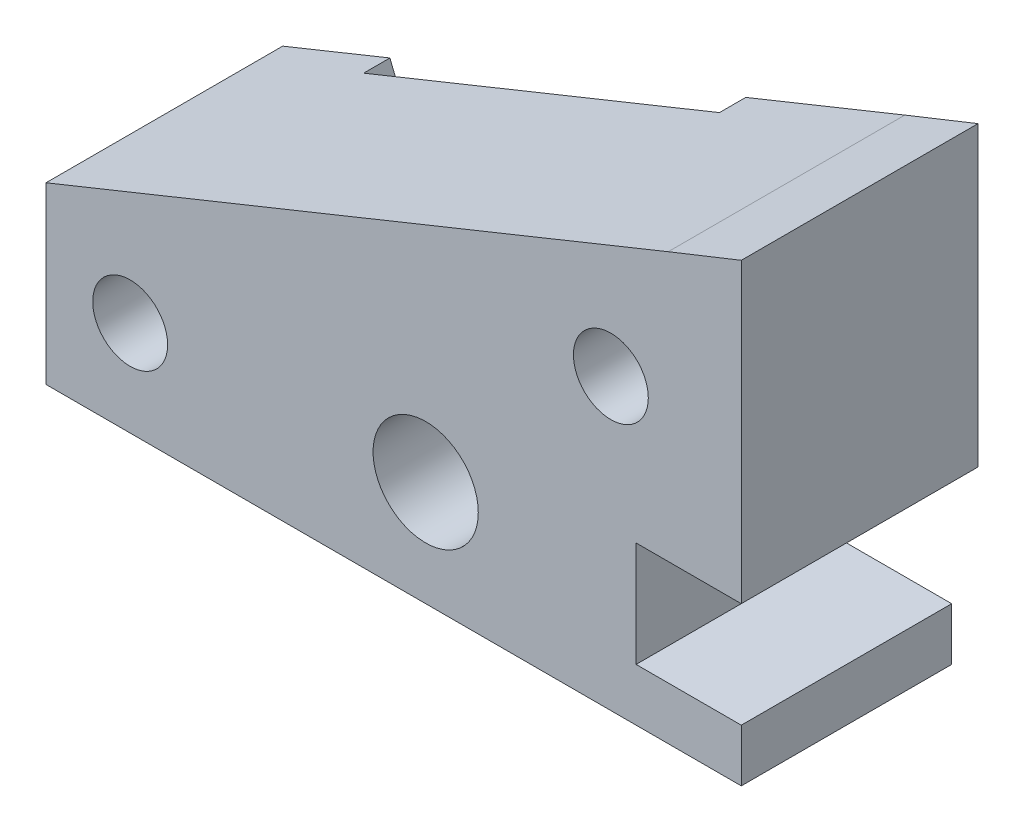
ISO-10303-21;
HEADER;
FILE_DESCRIPTION(('STEP AP214'),'2;1');
FILE_NAME('part.step','',(''),(''),'','','');
FILE_SCHEMA(('AUTOMOTIVE_DESIGN { 1 0 10303 214 1 1 1 1 }'));
ENDSEC;
DATA;
#1=APPLICATION_CONTEXT('core data for automotive mechanical design processes');
#2=APPLICATION_PROTOCOL_DEFINITION('international standard','automotive_design',2000,#1);
#3=PRODUCT_CONTEXT('',#1,'mechanical');
#4=PRODUCT('Part','Part','',(#3));
#5=PRODUCT_RELATED_PRODUCT_CATEGORY('part','',(#4));
#6=PRODUCT_DEFINITION_FORMATION('','',#4);
#7=PRODUCT_DEFINITION_CONTEXT('part definition',#1,'design');
#8=PRODUCT_DEFINITION('design','',#6,#7);
#9=PRODUCT_DEFINITION_SHAPE('','',#8);
#10=(LENGTH_UNIT() NAMED_UNIT(*) SI_UNIT(.MILLI.,.METRE.));
#11=(NAMED_UNIT(*) PLANE_ANGLE_UNIT() SI_UNIT($,.RADIAN.));
#12=(NAMED_UNIT(*) SI_UNIT($,.STERADIAN.) SOLID_ANGLE_UNIT());
#13=UNCERTAINTY_MEASURE_WITH_UNIT(LENGTH_MEASURE(1.E-05),#10,'distance_accuracy_value','');
#14=(GEOMETRIC_REPRESENTATION_CONTEXT(3) GLOBAL_UNCERTAINTY_ASSIGNED_CONTEXT((#13)) GLOBAL_UNIT_ASSIGNED_CONTEXT((#10,
#11,#12)) REPRESENTATION_CONTEXT('',''));
#15=CARTESIAN_POINT('',(0.,0.,0.));
#16=DIRECTION('',(0.,0.,1.));
#17=DIRECTION('',(1.,0.,0.));
#18=AXIS2_PLACEMENT_3D('',#15,#16,#17);
#19=CARTESIAN_POINT('',(-11.4586639342253,-3.17499999999992,0.));
#20=DIRECTION('',(0.,0.,-1.));
#21=DIRECTION('',(-1.,0.,0.));
#22=AXIS2_PLACEMENT_3D('',#19,#20,#21);
#23=PLANE('',#22);
#24=CARTESIAN_POINT('',(-8.91866393422528,-0.301005902888601,0.));
#25=DIRECTION('',(0.,0.,1.));
#26=DIRECTION('',(1.,0.,0.));
#27=AXIS2_PLACEMENT_3D('',#24,#25,#26);
#28=CIRCLE('',#27,1.1303);
#29=CARTESIAN_POINT('',(-7.78836393422528,-0.301005902888601,0.));
#30=VERTEX_POINT('',#29);
#31=EDGE_CURVE('E271',#30,#30,#28,.T.);
#32=ORIENTED_EDGE('',*,*,#31,.T.);
#33=EDGE_LOOP('',(#32));
#34=FACE_BOUND('',#33,.T.);
#35=DIRECTION('',(-0.927183854566792,-0.3746065934159,0.));
#36=VECTOR('',#35,1.);
#37=CARTESIAN_POINT('',(-11.4586639342253,2.09711529149145,0.));
#38=LINE('',#37,#36);
#39=CARTESIAN_POINT('',(-8.22400227584104,3.40400343318207,0.));
#40=VERTEX_POINT('',#39);
#41=CARTESIAN_POINT('',(-11.4586639342253,2.09711529149145,0.));
#42=VERTEX_POINT('',#41);
#43=EDGE_CURVE('E164',#40,#42,#38,.T.);
#44=ORIENTED_EDGE('',*,*,#43,.F.);
#45=DIRECTION('',(0.374606593415901,-0.927183854566792,0.));
#46=VECTOR('',#45,1.);
#47=CARTESIAN_POINT('',(-8.22400227584104,3.40400343318207,0.));
#48=LINE('',#47,#46);
#49=CARTESIAN_POINT('',(-5.56591234897607,-3.17499999999993,0.));
#50=VERTEX_POINT('',#49);
#51=EDGE_CURVE('E229',#40,#50,#48,.T.);
#52=ORIENTED_EDGE('',*,*,#51,.T.);
#53=DIRECTION('',(1.,0.,0.));
#54=VECTOR('',#53,1.);
#55=CARTESIAN_POINT('',(9.52499999999998,-3.17500000000007,0.));
#56=LINE('',#55,#54);
#57=CARTESIAN_POINT('',(-11.4586639342253,-3.17499999999992,0.));
#58=VERTEX_POINT('',#57);
#59=EDGE_CURVE('E150',#58,#50,#56,.T.);
#60=ORIENTED_EDGE('',*,*,#59,.F.);
#61=DIRECTION('',(0.,-1.,0.));
#62=VECTOR('',#61,1.);
#63=CARTESIAN_POINT('',(-11.4586639342253,-3.17499999999992,0.));
#64=LINE('',#63,#62);
#65=EDGE_CURVE('E89',#42,#58,#64,.T.);
#66=ORIENTED_EDGE('',*,*,#65,.F.);
#67=EDGE_LOOP('',(#44,#52,#60,#66));
#68=FACE_BOUND('',#67,.T.);
#69=ADVANCED_FACE('F40',(#34,#68),#23,.T.);
#70=CARTESIAN_POINT('',(5.58842552786858,5.56023870033394,0.));
#71=DIRECTION('',(0.,0.,1.));
#72=DIRECTION('',(1.,0.,0.));
#73=AXIS2_PLACEMENT_3D('',#70,#71,#72);
#74=CIRCLE('',#73,1.1303);
#75=CARTESIAN_POINT('',(6.71872552786858,5.56023870033394,0.));
#76=VERTEX_POINT('',#75);
#77=EDGE_CURVE('E266',#76,#76,#74,.T.);
#78=ORIENTED_EDGE('',*,*,#77,.T.);
#79=EDGE_LOOP('',(#78));
#80=FACE_BOUND('',#79,.T.);
#81=DIRECTION('',(1.,0.,0.));
#82=VECTOR('',#81,1.);
#83=CARTESIAN_POINT('',(6.35000000000001,1.58749999999996,0.));
#84=LINE('',#83,#82);
#85=CARTESIAN_POINT('',(6.14836106210429,1.58749999999994,0.));
#86=VERTEX_POINT('',#85);
#87=CARTESIAN_POINT('',(9.52500000000001,1.58749999999994,0.));
#88=VERTEX_POINT('',#87);
#89=EDGE_CURVE('E154',#86,#88,#84,.T.);
#90=ORIENTED_EDGE('',*,*,#89,.F.);
#91=CARTESIAN_POINT('',(0.,0.,0.));
#92=DIRECTION('',(0.,0.,1.));
#93=DIRECTION('',(1.,0.,0.));
#94=AXIS2_PLACEMENT_3D('',#91,#92,#93);
#95=CIRCLE('',#94,6.35);
#96=CARTESIAN_POINT('',(3.50362025846063,5.29595554026884,0.));
#97=VERTEX_POINT('',#96);
#98=EDGE_CURVE('E233',#86,#97,#95,.T.);
#99=ORIENTED_EDGE('',*,*,#98,.T.);
#100=DIRECTION('',(-0.374606593415901,0.927183854566792,0.));
#101=VECTOR('',#100,1.);
#102=CARTESIAN_POINT('',(2.51501200129337,7.7428468407624,0.));
#103=LINE('',#102,#101);
#104=CARTESIAN_POINT('',(2.51501200129337,7.7428468407624,0.));
#105=VERTEX_POINT('',#104);
#106=EDGE_CURVE('E238',#97,#105,#103,.T.);
#107=ORIENTED_EDGE('',*,*,#106,.T.);
#108=CARTESIAN_POINT('',(7.31930786211666,9.68390836520623,0.));
#109=VERTEX_POINT('',#108);
#110=EDGE_CURVE('E165',#109,#105,#38,.T.);
#111=ORIENTED_EDGE('',*,*,#110,.F.);
#112=DIRECTION('',(-0.928989410064675,-0.370106303631387,0.));
#113=VECTOR('',#112,1.);
#114=CARTESIAN_POINT('',(9.52500000000003,10.562648806439,0.));
#115=LINE('',#114,#113);
#116=CARTESIAN_POINT('',(9.52500000000003,10.562648806439,0.));
#117=VERTEX_POINT('',#116);
#118=EDGE_CURVE('E133',#117,#109,#115,.T.);
#119=ORIENTED_EDGE('',*,*,#118,.F.);
#120=DIRECTION('',(0.,1.,0.));
#121=VECTOR('',#120,1.);
#122=CARTESIAN_POINT('',(9.52500000000003,4.22462875204722,0.));
#123=LINE('',#122,#121);
#124=EDGE_CURVE('E159',#88,#117,#123,.T.);
#125=ORIENTED_EDGE('',*,*,#124,.F.);
#126=EDGE_LOOP('',(#90,#99,#107,#111,#119,#125));
#127=FACE_BOUND('',#126,.T.);
#128=ADVANCED_FACE('F350',(#80,#127),#23,.T.);
#129=CARTESIAN_POINT('',(-11.4586639342253,2.09711529149145,7.14375));
#130=DIRECTION('',(0.3746065934159,-0.927183854566792,0.));
#131=DIRECTION('',(0.927183854566792,0.3746065934159,0.));
#132=AXIS2_PLACEMENT_3D('',#129,#130,#131);
#133=PLANE('',#132);
#134=DIRECTION('',(0.,0.,-1.));
#135=VECTOR('',#134,1.);
#136=CARTESIAN_POINT('',(-8.22400227584104,3.40400343318207,0.79375));
#137=LINE('',#136,#135);
#138=CARTESIAN_POINT('',(-8.22400227584104,3.40400343318207,0.79375));
#139=VERTEX_POINT('',#138);
#140=EDGE_CURVE('E257',#139,#40,#137,.T.);
#141=ORIENTED_EDGE('',*,*,#140,.T.);
#142=ORIENTED_EDGE('',*,*,#43,.T.);
#143=DIRECTION('',(0.,0.,-1.));
#144=VECTOR('',#143,1.);
#145=CARTESIAN_POINT('',(-11.4586639342253,2.09711529149145,7.14375));
#146=LINE('',#145,#144);
#147=CARTESIAN_POINT('',(-11.4586639342253,2.09711529149145,7.14375));
#148=VERTEX_POINT('',#147);
#149=EDGE_CURVE('E139',#148,#42,#146,.T.);
#150=ORIENTED_EDGE('',*,*,#149,.F.);
#151=DIRECTION('',(-0.927183854566792,-0.3746065934159,0.));
#152=VECTOR('',#151,1.);
#153=CARTESIAN_POINT('',(-11.4586639342253,2.09711529149145,7.14375));
#154=LINE('',#153,#152);
#155=CARTESIAN_POINT('',(7.31930786211666,9.68390836520623,7.14375));
#156=VERTEX_POINT('',#155);
#157=EDGE_CURVE('E120',#156,#148,#154,.T.);
#158=ORIENTED_EDGE('',*,*,#157,.F.);
#159=DIRECTION('',(0.,0.,-1.));
#160=VECTOR('',#159,1.);
#161=CARTESIAN_POINT('',(7.31930786211666,9.68390836520623,7.14375));
#162=LINE('',#161,#160);
#163=EDGE_CURVE('E130',#156,#109,#162,.T.);
#164=ORIENTED_EDGE('',*,*,#163,.T.);
#165=ORIENTED_EDGE('',*,*,#110,.T.);
#166=DIRECTION('',(0.,0.,-1.));
#167=VECTOR('',#166,1.);
#168=CARTESIAN_POINT('',(2.51501200129337,7.7428468407624,0.79375));
#169=LINE('',#168,#167);
#170=CARTESIAN_POINT('',(2.51501200129338,7.7428468407624,0.79375));
#171=VERTEX_POINT('',#170);
#172=EDGE_CURVE('E228',#171,#105,#169,.T.);
#173=ORIENTED_EDGE('',*,*,#172,.F.);
#174=DIRECTION('',(-0.927183854566792,-0.374606593415901,0.));
#175=VECTOR('',#174,1.);
#176=CARTESIAN_POINT('',(-8.22400227584104,3.40400343318207,0.79375));
#177=LINE('',#176,#175);
#178=EDGE_CURVE('E56',#171,#139,#177,.T.);
#179=ORIENTED_EDGE('',*,*,#178,.T.);
#180=EDGE_LOOP('',(#141,#142,#150,#158,#164,#165,#173,#179));
#181=FACE_BOUND('',#180,.T.);
#182=ADVANCED_FACE('F142',(#181),#133,.F.);
#183=CARTESIAN_POINT('',(-11.4586639342253,-3.17499999999992,7.14375));
#184=DIRECTION('',(0.,0.,-1.));
#185=DIRECTION('',(-1.,0.,0.));
#186=AXIS2_PLACEMENT_3D('',#183,#184,#185);
#187=PLANE('',#186);
#188=CARTESIAN_POINT('',(-8.91866393422528,-0.301005902888601,7.14375));
#189=DIRECTION('',(0.,0.,1.));
#190=DIRECTION('',(1.,0.,0.));
#191=AXIS2_PLACEMENT_3D('',#188,#189,#190);
#192=CIRCLE('',#191,1.1303);
#193=CARTESIAN_POINT('',(-7.78836393422528,-0.301005902888601,7.14375));
#194=VERTEX_POINT('',#193);
#195=EDGE_CURVE('E275',#194,#194,#192,.T.);
#196=ORIENTED_EDGE('',*,*,#195,.F.);
#197=EDGE_LOOP('',(#196));
#198=FACE_BOUND('',#197,.T.);
#199=DIRECTION('',(1.,0.,0.));
#200=VECTOR('',#199,1.);
#201=CARTESIAN_POINT('',(9.52499999999998,-3.17500000000007,7.14375));
#202=LINE('',#201,#200);
#203=CARTESIAN_POINT('',(-11.4586639342253,-3.17499999999992,7.14375));
#204=VERTEX_POINT('',#203);
#205=CARTESIAN_POINT('',(9.52499999999998,-3.17500000000007,7.14375));
#206=VERTEX_POINT('',#205);
#207=EDGE_CURVE('E170',#204,#206,#202,.T.);
#208=ORIENTED_EDGE('',*,*,#207,.T.);
#209=DIRECTION('',(0.,1.,0.));
#210=VECTOR('',#209,1.);
#211=CARTESIAN_POINT('',(9.52499999999999,-1.58750000000007,7.14375));
#212=LINE('',#211,#210);
#213=CARTESIAN_POINT('',(9.52499999999999,-1.58750000000007,7.14375));
#214=VERTEX_POINT('',#213);
#215=EDGE_CURVE('E97',#206,#214,#212,.T.);
#216=ORIENTED_EDGE('',*,*,#215,.T.);
#217=DIRECTION('',(-1.,0.,0.));
#218=VECTOR('',#217,1.);
#219=CARTESIAN_POINT('',(6.34999999999999,-1.58750000000004,7.14375));
#220=LINE('',#219,#218);
#221=CARTESIAN_POINT('',(6.34999999999999,-1.58750000000004,7.14375));
#222=VERTEX_POINT('',#221);
#223=EDGE_CURVE('E197',#214,#222,#220,.T.);
#224=ORIENTED_EDGE('',*,*,#223,.T.);
#225=DIRECTION('',(0.,1.,0.));
#226=VECTOR('',#225,1.);
#227=CARTESIAN_POINT('',(6.34999999999999,-1.58750000000004,7.14375));
#228=LINE('',#227,#226);
#229=CARTESIAN_POINT('',(6.35000000000001,1.58749999999996,7.14375));
#230=VERTEX_POINT('',#229);
#231=EDGE_CURVE('E291',#222,#230,#228,.T.);
#232=ORIENTED_EDGE('',*,*,#231,.T.);
#233=DIRECTION('',(1.,0.,0.));
#234=VECTOR('',#233,1.);
#235=CARTESIAN_POINT('',(6.35000000000001,1.58749999999996,7.14375));
#236=LINE('',#235,#234);
#237=CARTESIAN_POINT('',(9.52500000000001,1.58749999999994,7.14375));
#238=VERTEX_POINT('',#237);
#239=EDGE_CURVE('E294',#230,#238,#236,.T.);
#240=ORIENTED_EDGE('',*,*,#239,.T.);
#241=DIRECTION('',(0.,1.,0.));
#242=VECTOR('',#241,1.);
#243=CARTESIAN_POINT('',(9.52500000000001,1.58749999999994,7.14375));
#244=LINE('',#243,#242);
#245=CARTESIAN_POINT('',(9.52500000000003,10.562648806439,7.14375));
#246=VERTEX_POINT('',#245);
#247=EDGE_CURVE('E123',#238,#246,#244,.T.);
#248=ORIENTED_EDGE('',*,*,#247,.T.);
#249=DIRECTION('',(-0.928989410064675,-0.370106303631387,0.));
#250=VECTOR('',#249,1.);
#251=CARTESIAN_POINT('',(9.52500000000003,10.562648806439,7.14375));
#252=LINE('',#251,#250);
#253=EDGE_CURVE('E115',#246,#156,#252,.T.);
#254=ORIENTED_EDGE('',*,*,#253,.T.);
#255=ORIENTED_EDGE('',*,*,#157,.T.);
#256=DIRECTION('',(0.,-1.,0.));
#257=VECTOR('',#256,1.);
#258=CARTESIAN_POINT('',(-11.4586639342253,-3.17499999999992,7.14375));
#259=LINE('',#258,#257);
#260=EDGE_CURVE('E65',#148,#204,#259,.T.);
#261=ORIENTED_EDGE('',*,*,#260,.T.);
#262=EDGE_LOOP('',(#208,#216,#224,#232,#240,#248,#254,#255,#261));
#263=FACE_BOUND('',#262,.T.);
#264=CARTESIAN_POINT('',(0.,0.,7.14375));
#265=DIRECTION('',(0.,0.,1.));
#266=DIRECTION('',(1.,0.,0.));
#267=AXIS2_PLACEMENT_3D('',#264,#265,#266);
#268=CIRCLE('',#267,1.58749999999992);
#269=CARTESIAN_POINT('',(1.58749999999992,0.,7.14375));
#270=VERTEX_POINT('',#269);
#271=EDGE_CURVE('E155',#270,#270,#268,.T.);
#272=ORIENTED_EDGE('',*,*,#271,.F.);
#273=EDGE_LOOP('',(#272));
#274=FACE_BOUND('',#273,.T.);
#275=CARTESIAN_POINT('',(5.58842552786858,5.56023870033394,7.14375));
#276=DIRECTION('',(0.,0.,1.));
#277=DIRECTION('',(1.,0.,0.));
#278=AXIS2_PLACEMENT_3D('',#275,#276,#277);
#279=CIRCLE('',#278,1.1303);
#280=CARTESIAN_POINT('',(6.71872552786858,5.56023870033394,7.14375));
#281=VERTEX_POINT('',#280);
#282=EDGE_CURVE('E267',#281,#281,#279,.T.);
#283=ORIENTED_EDGE('',*,*,#282,.F.);
#284=EDGE_LOOP('',(#283));
#285=FACE_BOUND('',#284,.T.);
#286=ADVANCED_FACE('F117',(#198,#263,#274,#285),#187,.F.);
#287=CARTESIAN_POINT('',(9.52499999999998,-3.17500000000007,7.14375));
#288=DIRECTION('',(0.,1.,0.));
#289=DIRECTION('',(-1.,0.,0.));
#290=AXIS2_PLACEMENT_3D('',#287,#288,#289);
#291=PLANE('',#290);
#292=DIRECTION('',(0.,0.,-1.));
#293=VECTOR('',#292,1.);
#294=CARTESIAN_POINT('',(-5.56591234897607,-3.17499999999993,0.79375));
#295=LINE('',#294,#293);
#296=CARTESIAN_POINT('',(-5.56591234897607,-3.17499999999993,0.79375));
#297=VERTEX_POINT('',#296);
#298=EDGE_CURVE('E253',#297,#50,#295,.T.);
#299=ORIENTED_EDGE('',*,*,#298,.F.);
#300=DIRECTION('',(1.,0.,0.));
#301=VECTOR('',#300,1.);
#302=CARTESIAN_POINT('',(9.52499999999998,-3.17500000000007,0.79375));
#303=LINE('',#302,#301);
#304=CARTESIAN_POINT('',(9.52499999999998,-3.17500000000007,0.79375));
#305=VERTEX_POINT('',#304);
#306=EDGE_CURVE('E211',#297,#305,#303,.T.);
#307=ORIENTED_EDGE('',*,*,#306,.T.);
#308=DIRECTION('',(0.,0.,-1.));
#309=VECTOR('',#308,1.);
#310=CARTESIAN_POINT('',(9.52499999999998,-3.17500000000007,7.14375));
#311=LINE('',#310,#309);
#312=EDGE_CURVE('E11',#206,#305,#311,.T.);
#313=ORIENTED_EDGE('',*,*,#312,.F.);
#314=ORIENTED_EDGE('',*,*,#207,.F.);
#315=DIRECTION('',(0.,0.,-1.));
#316=VECTOR('',#315,1.);
#317=CARTESIAN_POINT('',(-11.4586639342253,-3.17499999999992,7.14375));
#318=LINE('',#317,#316);
#319=EDGE_CURVE('E146',#204,#58,#318,.T.);
#320=ORIENTED_EDGE('',*,*,#319,.T.);
#321=ORIENTED_EDGE('',*,*,#59,.T.);
#322=EDGE_LOOP('',(#299,#307,#313,#314,#320,#321));
#323=FACE_BOUND('',#322,.T.);
#324=ADVANCED_FACE('F42',(#323),#291,.F.);
#325=CARTESIAN_POINT('',(9.52499999999999,-1.58750000000007,7.14375));
#326=DIRECTION('',(-1.,0.,0.));
#327=DIRECTION('',(0.,-1.,0.));
#328=AXIS2_PLACEMENT_3D('',#325,#326,#327);
#329=PLANE('',#328);
#330=ORIENTED_EDGE('',*,*,#312,.T.);
#331=DIRECTION('',(0.,1.,0.));
#332=VECTOR('',#331,1.);
#333=CARTESIAN_POINT('',(9.52500000000001,1.58749999999994,0.79375));
#334=LINE('',#333,#332);
#335=CARTESIAN_POINT('',(9.52499999999999,-1.58750000000006,0.79375));
#336=VERTEX_POINT('',#335);
#337=EDGE_CURVE('E204',#305,#336,#334,.T.);
#338=ORIENTED_EDGE('',*,*,#337,.T.);
#339=DIRECTION('',(0.,0.,-1.));
#340=VECTOR('',#339,1.);
#341=CARTESIAN_POINT('',(9.52499999999999,-1.58750000000007,7.14375));
#342=LINE('',#341,#340);
#343=EDGE_CURVE('E49',#214,#336,#342,.T.);
#344=ORIENTED_EDGE('',*,*,#343,.F.);
#345=ORIENTED_EDGE('',*,*,#215,.F.);
#346=EDGE_LOOP('',(#330,#338,#344,#345));
#347=FACE_BOUND('',#346,.T.);
#348=ADVANCED_FACE('F202',(#347),#329,.F.);
#349=CARTESIAN_POINT('',(6.34999999999999,-1.58750000000004,7.14375));
#350=DIRECTION('',(0.,-1.,0.));
#351=DIRECTION('',(1.,0.,0.));
#352=AXIS2_PLACEMENT_3D('',#349,#350,#351);
#353=PLANE('',#352);
#354=ORIENTED_EDGE('',*,*,#343,.T.);
#355=DIRECTION('',(-1.,0.,0.));
#356=VECTOR('',#355,1.);
#357=CARTESIAN_POINT('',(6.34999999999999,-1.58750000000004,0.79375));
#358=LINE('',#357,#356);
#359=CARTESIAN_POINT('',(6.34999999999999,-1.58750000000004,0.79375));
#360=VERTEX_POINT('',#359);
#361=EDGE_CURVE('E196',#336,#360,#358,.T.);
#362=ORIENTED_EDGE('',*,*,#361,.T.);
#363=DIRECTION('',(0.,0.,-1.));
#364=VECTOR('',#363,1.);
#365=CARTESIAN_POINT('',(6.34999999999999,-1.58750000000004,7.14375));
#366=LINE('',#365,#364);
#367=EDGE_CURVE('E184',#222,#360,#366,.T.);
#368=ORIENTED_EDGE('',*,*,#367,.F.);
#369=ORIENTED_EDGE('',*,*,#223,.F.);
#370=EDGE_LOOP('',(#354,#362,#368,#369));
#371=FACE_BOUND('',#370,.T.);
#372=ADVANCED_FACE('F193',(#371),#353,.F.);
#373=CARTESIAN_POINT('',(6.34999999999999,-1.58750000000004,7.14375));
#374=DIRECTION('',(-1.,0.,0.));
#375=DIRECTION('',(0.,-1.,0.));
#376=AXIS2_PLACEMENT_3D('',#373,#374,#375);
#377=PLANE('',#376);
#378=ORIENTED_EDGE('',*,*,#367,.T.);
#379=DIRECTION('',(0.,1.,0.));
#380=VECTOR('',#379,1.);
#381=CARTESIAN_POINT('',(6.34999999999999,-1.58750000000004,0.79375));
#382=LINE('',#381,#380);
#383=CARTESIAN_POINT('',(6.35000000000001,1.58749999999994,0.79375));
#384=VERTEX_POINT('',#383);
#385=EDGE_CURVE('E260',#360,#384,#382,.T.);
#386=ORIENTED_EDGE('',*,*,#385,.T.);
#387=DIRECTION('',(0.,0.,-1.));
#388=VECTOR('',#387,1.);
#389=CARTESIAN_POINT('',(6.35000000000001,1.58749999999996,7.14375));
#390=LINE('',#389,#388);
#391=EDGE_CURVE('E180',#230,#384,#390,.T.);
#392=ORIENTED_EDGE('',*,*,#391,.F.);
#393=ORIENTED_EDGE('',*,*,#231,.F.);
#394=EDGE_LOOP('',(#378,#386,#392,#393));
#395=FACE_BOUND('',#394,.T.);
#396=ADVANCED_FACE('F329',(#395),#377,.F.);
#397=CARTESIAN_POINT('',(6.35000000000001,1.58749999999996,7.14375));
#398=DIRECTION('',(0.,1.,0.));
#399=DIRECTION('',(-1.,0.,0.));
#400=AXIS2_PLACEMENT_3D('',#397,#398,#399);
#401=PLANE('',#400);
#402=ORIENTED_EDGE('',*,*,#391,.T.);
#403=DIRECTION('',(-1.,0.,0.));
#404=VECTOR('',#403,1.);
#405=CARTESIAN_POINT('',(9.52500000000001,1.58749999999994,0.79375));
#406=LINE('',#405,#404);
#407=CARTESIAN_POINT('',(6.14836106210429,1.58749999999994,0.79375));
#408=VERTEX_POINT('',#407);
#409=EDGE_CURVE('E210',#384,#408,#406,.T.);
#410=ORIENTED_EDGE('',*,*,#409,.T.);
#411=DIRECTION('',(0.,0.,-1.));
#412=VECTOR('',#411,1.);
#413=CARTESIAN_POINT('',(6.14836106210429,1.58749999999994,0.79375));
#414=LINE('',#413,#412);
#415=EDGE_CURVE('E249',#408,#86,#414,.T.);
#416=ORIENTED_EDGE('',*,*,#415,.T.);
#417=ORIENTED_EDGE('',*,*,#89,.T.);
#418=DIRECTION('',(0.,0.,-1.));
#419=VECTOR('',#418,1.);
#420=CARTESIAN_POINT('',(9.52500000000001,1.58749999999994,7.14375));
#421=LINE('',#420,#419);
#422=EDGE_CURVE('E177',#238,#88,#421,.T.);
#423=ORIENTED_EDGE('',*,*,#422,.F.);
#424=ORIENTED_EDGE('',*,*,#239,.F.);
#425=EDGE_LOOP('',(#402,#410,#416,#417,#423,#424));
#426=FACE_BOUND('',#425,.T.);
#427=ADVANCED_FACE('F333',(#426),#401,.F.);
#428=CARTESIAN_POINT('',(9.52500000000003,4.22462875204722,7.14375));
#429=DIRECTION('',(-1.,0.,0.));
#430=DIRECTION('',(0.,-1.,0.));
#431=AXIS2_PLACEMENT_3D('',#428,#429,#430);
#432=PLANE('',#431);
#433=ORIENTED_EDGE('',*,*,#124,.T.);
#434=DIRECTION('',(0.,0.,-1.));
#435=VECTOR('',#434,1.);
#436=CARTESIAN_POINT('',(9.52500000000003,10.562648806439,7.14375));
#437=LINE('',#436,#435);
#438=EDGE_CURVE('E138',#246,#117,#437,.T.);
#439=ORIENTED_EDGE('',*,*,#438,.F.);
#440=ORIENTED_EDGE('',*,*,#247,.F.);
#441=ORIENTED_EDGE('',*,*,#422,.T.);
#442=EDGE_LOOP('',(#433,#439,#440,#441));
#443=FACE_BOUND('',#442,.T.);
#444=ADVANCED_FACE('F353',(#443),#432,.F.);
#445=CARTESIAN_POINT('',(9.52500000000003,10.562648806439,7.14375));
#446=DIRECTION('',(0.370106303631387,-0.928989410064674,0.));
#447=DIRECTION('',(0.928989410064675,0.370106303631387,0.));
#448=AXIS2_PLACEMENT_3D('',#445,#446,#447);
#449=PLANE('',#448);
#450=ORIENTED_EDGE('',*,*,#118,.T.);
#451=ORIENTED_EDGE('',*,*,#163,.F.);
#452=ORIENTED_EDGE('',*,*,#253,.F.);
#453=ORIENTED_EDGE('',*,*,#438,.T.);
#454=EDGE_LOOP('',(#450,#451,#452,#453));
#455=FACE_BOUND('',#454,.T.);
#456=ADVANCED_FACE('F131',(#455),#449,.F.);
#457=CARTESIAN_POINT('',(-11.4586639342253,-3.17499999999992,7.14375));
#458=DIRECTION('',(1.,0.,0.));
#459=DIRECTION('',(0.,0.,-1.));
#460=AXIS2_PLACEMENT_3D('',#457,#458,#459);
#461=PLANE('',#460);
#462=ORIENTED_EDGE('',*,*,#65,.T.);
#463=ORIENTED_EDGE('',*,*,#319,.F.);
#464=ORIENTED_EDGE('',*,*,#260,.F.);
#465=ORIENTED_EDGE('',*,*,#149,.T.);
#466=EDGE_LOOP('',(#462,#463,#464,#465));
#467=FACE_BOUND('',#466,.T.);
#468=ADVANCED_FACE('F302',(#467),#461,.F.);
#469=CARTESIAN_POINT('',(0.,0.,7.14375));
#470=DIRECTION('',(0.,0.,-1.));
#471=DIRECTION('',(-1.,0.,0.));
#472=AXIS2_PLACEMENT_3D('',#469,#470,#471);
#473=CYLINDRICAL_SURFACE('',#472,1.58749999999992);
#474=CARTESIAN_POINT('',(0.,0.,0.79375));
#475=DIRECTION('',(0.,0.,1.));
#476=DIRECTION('',(1.,0.,0.));
#477=AXIS2_PLACEMENT_3D('',#474,#475,#476);
#478=CIRCLE('',#477,1.58749999999996);
#479=CARTESIAN_POINT('',(1.58749999999996,0.,0.79375));
#480=VERTEX_POINT('',#479);
#481=EDGE_CURVE('E234',#480,#480,#478,.T.);
#482=ORIENTED_EDGE('',*,*,#481,.F.);
#483=EDGE_LOOP('',(#482));
#484=FACE_BOUND('',#483,.T.);
#485=ORIENTED_EDGE('',*,*,#271,.T.);
#486=EDGE_LOOP('',(#485));
#487=FACE_BOUND('',#486,.T.);
#488=ADVANCED_FACE('F374',(#484,#487),#473,.F.);
#489=CARTESIAN_POINT('',(-8.91866393422528,-0.301005902888601,7.14375));
#490=DIRECTION('',(0.,0.,-1.));
#491=DIRECTION('',(-1.,0.,0.));
#492=AXIS2_PLACEMENT_3D('',#489,#490,#491);
#493=CYLINDRICAL_SURFACE('',#492,1.1303);
#494=ORIENTED_EDGE('',*,*,#195,.T.);
#495=EDGE_LOOP('',(#494));
#496=FACE_BOUND('',#495,.T.);
#497=ORIENTED_EDGE('',*,*,#31,.F.);
#498=EDGE_LOOP('',(#497));
#499=FACE_BOUND('',#498,.T.);
#500=ADVANCED_FACE('F385',(#496,#499),#493,.F.);
#501=CARTESIAN_POINT('',(5.58842552786858,5.56023870033394,7.14375));
#502=DIRECTION('',(0.,0.,-1.));
#503=DIRECTION('',(-1.,0.,0.));
#504=AXIS2_PLACEMENT_3D('',#501,#502,#503);
#505=CYLINDRICAL_SURFACE('',#504,1.1303);
#506=ORIENTED_EDGE('',*,*,#282,.T.);
#507=EDGE_LOOP('',(#506));
#508=FACE_BOUND('',#507,.T.);
#509=ORIENTED_EDGE('',*,*,#77,.F.);
#510=EDGE_LOOP('',(#509));
#511=FACE_BOUND('',#510,.T.);
#512=ADVANCED_FACE('F388',(#508,#511),#505,.F.);
#513=CARTESIAN_POINT('',(0.,0.,0.79375));
#514=DIRECTION('',(0.,0.,1.));
#515=DIRECTION('',(1.,0.,0.));
#516=AXIS2_PLACEMENT_3D('',#513,#514,#515);
#517=PLANE('',#516);
#518=ORIENTED_EDGE('',*,*,#481,.T.);
#519=EDGE_LOOP('',(#518));
#520=FACE_BOUND('',#519,.T.);
#521=ORIENTED_EDGE('',*,*,#337,.F.);
#522=ORIENTED_EDGE('',*,*,#306,.F.);
#523=DIRECTION('',(0.374606593415901,-0.927183854566792,0.));
#524=VECTOR('',#523,1.);
#525=CARTESIAN_POINT('',(-8.22400227584104,3.40400343318207,0.79375));
#526=LINE('',#525,#524);
#527=EDGE_CURVE('E218',#139,#297,#526,.T.);
#528=ORIENTED_EDGE('',*,*,#527,.F.);
#529=ORIENTED_EDGE('',*,*,#178,.F.);
#530=DIRECTION('',(-0.374606593415901,0.927183854566792,0.));
#531=VECTOR('',#530,1.);
#532=CARTESIAN_POINT('',(2.51501200129337,7.7428468407624,0.79375));
#533=LINE('',#532,#531);
#534=CARTESIAN_POINT('',(3.50362025846063,5.29595554026884,0.79375));
#535=VERTEX_POINT('',#534);
#536=EDGE_CURVE('E225',#535,#171,#533,.T.);
#537=ORIENTED_EDGE('',*,*,#536,.F.);
#538=CARTESIAN_POINT('',(0.,0.,0.79375));
#539=DIRECTION('',(0.,0.,1.));
#540=DIRECTION('',(1.,0.,0.));
#541=AXIS2_PLACEMENT_3D('',#538,#539,#540);
#542=CIRCLE('',#541,6.35);
#543=EDGE_CURVE('E216',#408,#535,#542,.T.);
#544=ORIENTED_EDGE('',*,*,#543,.F.);
#545=ORIENTED_EDGE('',*,*,#409,.F.);
#546=ORIENTED_EDGE('',*,*,#385,.F.);
#547=ORIENTED_EDGE('',*,*,#361,.F.);
#548=EDGE_LOOP('',(#521,#522,#528,#529,#537,#544,#545,#546,#547));
#549=FACE_BOUND('',#548,.T.);
#550=ADVANCED_FACE('F326',(#520,#549),#517,.F.);
#551=CARTESIAN_POINT('',(-8.22400227584104,3.40400343318207,0.79375));
#552=DIRECTION('',(0.927183854566792,0.374606593415901,0.));
#553=DIRECTION('',(-0.374606593415901,0.927183854566792,0.));
#554=AXIS2_PLACEMENT_3D('',#551,#552,#553);
#555=PLANE('',#554);
#556=ORIENTED_EDGE('',*,*,#51,.F.);
#557=ORIENTED_EDGE('',*,*,#140,.F.);
#558=ORIENTED_EDGE('',*,*,#527,.T.);
#559=ORIENTED_EDGE('',*,*,#298,.T.);
#560=EDGE_LOOP('',(#556,#557,#558,#559));
#561=FACE_BOUND('',#560,.T.);
#562=ADVANCED_FACE('F399',(#561),#555,.T.);
#563=CARTESIAN_POINT('',(0.,0.,0.79375));
#564=DIRECTION('',(0.,0.,-1.));
#565=DIRECTION('',(-1.,0.,0.));
#566=AXIS2_PLACEMENT_3D('',#563,#564,#565);
#567=CYLINDRICAL_SURFACE('',#566,6.35);
#568=ORIENTED_EDGE('',*,*,#98,.F.);
#569=ORIENTED_EDGE('',*,*,#415,.F.);
#570=ORIENTED_EDGE('',*,*,#543,.T.);
#571=DIRECTION('',(0.,0.,-1.));
#572=VECTOR('',#571,1.);
#573=CARTESIAN_POINT('',(3.50362025846063,5.29595554026884,0.79375));
#574=LINE('',#573,#572);
#575=EDGE_CURVE('E245',#535,#97,#574,.T.);
#576=ORIENTED_EDGE('',*,*,#575,.T.);
#577=EDGE_LOOP('',(#568,#569,#570,#576));
#578=FACE_BOUND('',#577,.T.);
#579=ADVANCED_FACE('F344',(#578),#567,.F.);
#580=CARTESIAN_POINT('',(2.51501200129337,7.7428468407624,0.79375));
#581=DIRECTION('',(-0.927183854566792,-0.374606593415901,0.));
#582=DIRECTION('',(0.374606593415901,-0.927183854566792,0.));
#583=AXIS2_PLACEMENT_3D('',#580,#581,#582);
#584=PLANE('',#583);
#585=ORIENTED_EDGE('',*,*,#106,.F.);
#586=ORIENTED_EDGE('',*,*,#575,.F.);
#587=ORIENTED_EDGE('',*,*,#536,.T.);
#588=ORIENTED_EDGE('',*,*,#172,.T.);
#589=EDGE_LOOP('',(#585,#586,#587,#588));
#590=FACE_BOUND('',#589,.T.);
#591=ADVANCED_FACE('F347',(#590),#584,.T.);
#592=CLOSED_SHELL('',(#69,#128,#182,#286,#324,#348,#372,#396,#427,#444,#456,#468,#488,#500,#512,
#550,#562,#579,#591));
#593=MANIFOLD_SOLID_BREP('B2',#592);
#594=ADVANCED_BREP_SHAPE_REPRESENTATION('',(#18,#593),#14);
#595=SHAPE_DEFINITION_REPRESENTATION(#9,#594);
ENDSEC;
END-ISO-10303-21;
